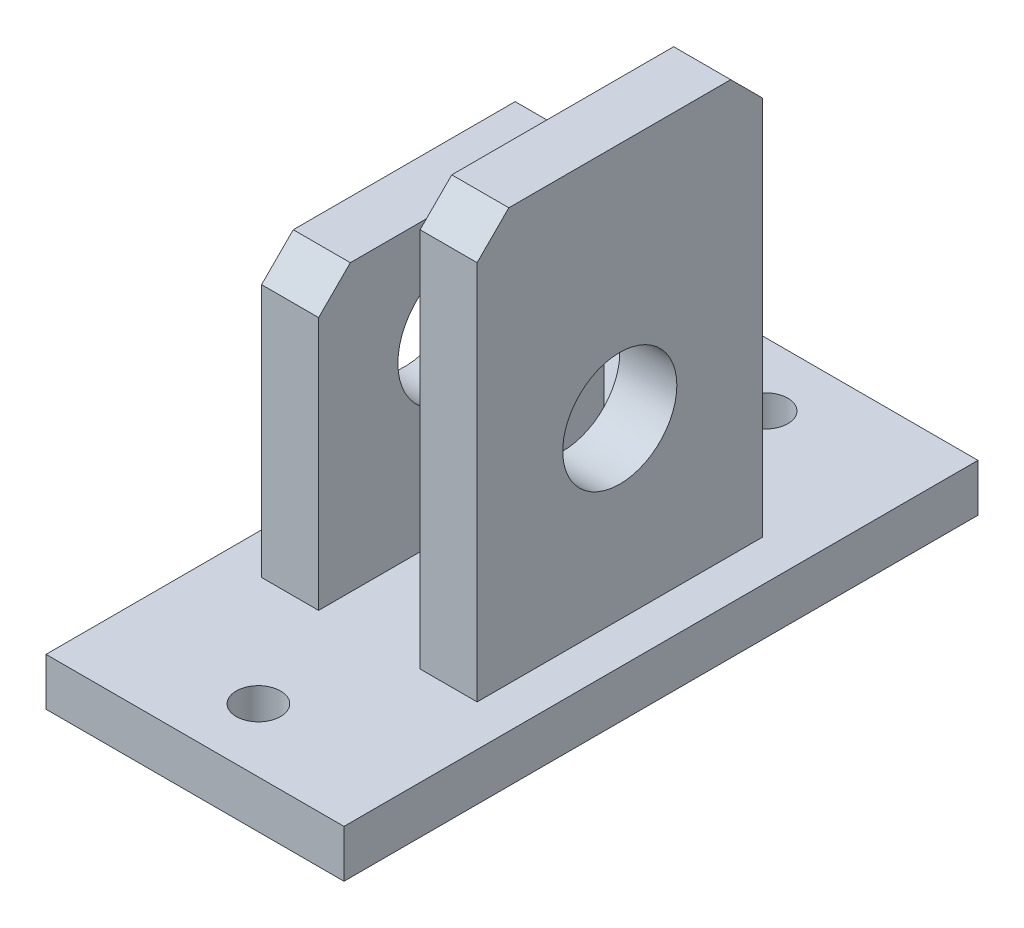
ISO-10303-21;
HEADER;
FILE_DESCRIPTION(('STEP AP214'),'2;1');
FILE_NAME('part.step','',(''),(''),'','','');
FILE_SCHEMA(('AUTOMOTIVE_DESIGN { 1 0 10303 214 1 1 1 1 }'));
ENDSEC;
DATA;
#1=APPLICATION_CONTEXT('core data for automotive mechanical design processes');
#2=APPLICATION_PROTOCOL_DEFINITION('international standard','automotive_design',2000,#1);
#3=PRODUCT_CONTEXT('',#1,'mechanical');
#4=PRODUCT('Part','Part','',(#3));
#5=PRODUCT_RELATED_PRODUCT_CATEGORY('part','',(#4));
#6=PRODUCT_DEFINITION_FORMATION('','',#4);
#7=PRODUCT_DEFINITION_CONTEXT('part definition',#1,'design');
#8=PRODUCT_DEFINITION('design','',#6,#7);
#9=PRODUCT_DEFINITION_SHAPE('','',#8);
#10=(LENGTH_UNIT() NAMED_UNIT(*) SI_UNIT(.MILLI.,.METRE.));
#11=(NAMED_UNIT(*) PLANE_ANGLE_UNIT() SI_UNIT($,.RADIAN.));
#12=(NAMED_UNIT(*) SI_UNIT($,.STERADIAN.) SOLID_ANGLE_UNIT());
#13=UNCERTAINTY_MEASURE_WITH_UNIT(LENGTH_MEASURE(1.E-05),#10,'distance_accuracy_value','');
#14=(GEOMETRIC_REPRESENTATION_CONTEXT(3) GLOBAL_UNCERTAINTY_ASSIGNED_CONTEXT((#13)) GLOBAL_UNIT_ASSIGNED_CONTEXT((#10,
#11,#12)) REPRESENTATION_CONTEXT('',''));
#15=CARTESIAN_POINT('',(0.,0.,0.));
#16=DIRECTION('',(0.,0.,1.));
#17=DIRECTION('',(1.,0.,0.));
#18=AXIS2_PLACEMENT_3D('',#15,#16,#17);
#19=CARTESIAN_POINT('',(0.,15.,-200.));
#20=DIRECTION('',(0.,-1.,0.));
#21=DIRECTION('',(0.,0.,-1.));
#22=AXIS2_PLACEMENT_3D('',#19,#20,#21);
#23=PLANE('',#22);
#24=CARTESIAN_POINT('',(47.,15.,-20.));
#25=DIRECTION('',(0.,1.,0.));
#26=DIRECTION('',(0.,0.,-1.));
#27=AXIS2_PLACEMENT_3D('',#24,#25,#26);
#28=CIRCLE('',#27,7.);
#29=CARTESIAN_POINT('',(47.,15.,-13.));
#30=VERTEX_POINT('',#29);
#31=EDGE_CURVE('E249',#30,#30,#28,.T.);
#32=ORIENTED_EDGE('',*,*,#31,.F.);
#33=EDGE_LOOP('',(#32));
#34=FACE_BOUND('',#33,.T.);
#35=CARTESIAN_POINT('',(47.,15.,-180.));
#36=DIRECTION('',(0.,1.,0.));
#37=DIRECTION('',(0.,0.,1.));
#38=AXIS2_PLACEMENT_3D('',#35,#36,#37);
#39=CIRCLE('',#38,7.);
#40=CARTESIAN_POINT('',(47.,15.,-173.));
#41=VERTEX_POINT('',#40);
#42=EDGE_CURVE('E245',#41,#41,#39,.T.);
#43=ORIENTED_EDGE('',*,*,#42,.F.);
#44=EDGE_LOOP('',(#43));
#45=FACE_BOUND('',#44,.T.);
#46=DIRECTION('',(1.,0.,0.));
#47=VECTOR('',#46,1.);
#48=CARTESIAN_POINT('',(63.,15.,-55.));
#49=LINE('',#48,#47);
#50=CARTESIAN_POINT('',(63.,15.,-55.));
#51=VERTEX_POINT('',#50);
#52=CARTESIAN_POINT('',(81.,15.,-55.));
#53=VERTEX_POINT('',#52);
#54=EDGE_CURVE('E192',#51,#53,#49,.T.);
#55=ORIENTED_EDGE('',*,*,#54,.F.);
#56=DIRECTION('',(0.,0.,1.));
#57=VECTOR('',#56,1.);
#58=CARTESIAN_POINT('',(63.,15.,-55.));
#59=LINE('',#58,#57);
#60=CARTESIAN_POINT('',(63.,15.,-145.));
#61=VERTEX_POINT('',#60);
#62=EDGE_CURVE('E201',#61,#51,#59,.T.);
#63=ORIENTED_EDGE('',*,*,#62,.F.);
#64=DIRECTION('',(-1.,0.,0.));
#65=VECTOR('',#64,1.);
#66=CARTESIAN_POINT('',(63.,15.,-145.));
#67=LINE('',#66,#65);
#68=CARTESIAN_POINT('',(81.,15.,-145.));
#69=VERTEX_POINT('',#68);
#70=EDGE_CURVE('E198',#69,#61,#67,.T.);
#71=ORIENTED_EDGE('',*,*,#70,.F.);
#72=DIRECTION('',(0.,0.,-1.));
#73=VECTOR('',#72,1.);
#74=CARTESIAN_POINT('',(81.,15.,-55.));
#75=LINE('',#74,#73);
#76=EDGE_CURVE('E195',#53,#69,#75,.T.);
#77=ORIENTED_EDGE('',*,*,#76,.F.);
#78=EDGE_LOOP('',(#55,#63,#71,#77));
#79=FACE_BOUND('',#78,.T.);
#80=DIRECTION('',(0.,0.,1.));
#81=VECTOR('',#80,1.);
#82=CARTESIAN_POINT('',(0.,15.,0.));
#83=LINE('',#82,#81);
#84=CARTESIAN_POINT('',(0.,15.,-200.));
#85=VERTEX_POINT('',#84);
#86=CARTESIAN_POINT('',(0.,15.,0.));
#87=VERTEX_POINT('',#86);
#88=EDGE_CURVE('E213',#85,#87,#83,.T.);
#89=ORIENTED_EDGE('',*,*,#88,.T.);
#90=DIRECTION('',(1.,0.,0.));
#91=VECTOR('',#90,1.);
#92=CARTESIAN_POINT('',(0.,15.,0.));
#93=LINE('',#92,#91);
#94=CARTESIAN_POINT('',(94.,15.,0.));
#95=VERTEX_POINT('',#94);
#96=EDGE_CURVE('E216',#87,#95,#93,.T.);
#97=ORIENTED_EDGE('',*,*,#96,.T.);
#98=DIRECTION('',(0.,0.,-1.));
#99=VECTOR('',#98,1.);
#100=CARTESIAN_POINT('',(94.,15.,0.));
#101=LINE('',#100,#99);
#102=CARTESIAN_POINT('',(94.,15.,-200.));
#103=VERTEX_POINT('',#102);
#104=EDGE_CURVE('E219',#95,#103,#101,.T.);
#105=ORIENTED_EDGE('',*,*,#104,.T.);
#106=DIRECTION('',(-1.,0.,0.));
#107=VECTOR('',#106,1.);
#108=CARTESIAN_POINT('',(0.,15.,-200.));
#109=LINE('',#108,#107);
#110=EDGE_CURVE('E221',#103,#85,#109,.T.);
#111=ORIENTED_EDGE('',*,*,#110,.T.);
#112=EDGE_LOOP('',(#89,#97,#105,#111));
#113=FACE_BOUND('',#112,.T.);
#114=DIRECTION('',(0.,0.,1.));
#115=VECTOR('',#114,1.);
#116=CARTESIAN_POINT('',(13.,15.,-55.));
#117=LINE('',#116,#115);
#118=CARTESIAN_POINT('',(13.,15.,-145.));
#119=VERTEX_POINT('',#118);
#120=CARTESIAN_POINT('',(13.,15.,-55.));
#121=VERTEX_POINT('',#120);
#122=EDGE_CURVE('E159',#119,#121,#117,.T.);
#123=ORIENTED_EDGE('',*,*,#122,.F.);
#124=DIRECTION('',(-1.,0.,0.));
#125=VECTOR('',#124,1.);
#126=CARTESIAN_POINT('',(31.,15.,-145.));
#127=LINE('',#126,#125);
#128=CARTESIAN_POINT('',(31.,15.,-145.));
#129=VERTEX_POINT('',#128);
#130=EDGE_CURVE('E171',#129,#119,#127,.T.);
#131=ORIENTED_EDGE('',*,*,#130,.F.);
#132=DIRECTION('',(0.,0.,-1.));
#133=VECTOR('',#132,1.);
#134=CARTESIAN_POINT('',(31.,15.,-55.));
#135=LINE('',#134,#133);
#136=CARTESIAN_POINT('',(31.,15.,-55.));
#137=VERTEX_POINT('',#136);
#138=EDGE_CURVE('E180',#137,#129,#135,.T.);
#139=ORIENTED_EDGE('',*,*,#138,.F.);
#140=DIRECTION('',(1.,0.,0.));
#141=VECTOR('',#140,1.);
#142=CARTESIAN_POINT('',(31.,15.,-55.));
#143=LINE('',#142,#141);
#144=EDGE_CURVE('E174',#121,#137,#143,.T.);
#145=ORIENTED_EDGE('',*,*,#144,.F.);
#146=EDGE_LOOP('',(#123,#131,#139,#145));
#147=FACE_BOUND('',#146,.T.);
#148=ADVANCED_FACE('F41',(#34,#45,#79,#113,#147),#23,.F.);
#149=CARTESIAN_POINT('',(0.,15.,0.));
#150=DIRECTION('',(1.,0.,0.));
#151=DIRECTION('',(0.,0.,-1.));
#152=AXIS2_PLACEMENT_3D('',#149,#150,#151);
#153=PLANE('',#152);
#154=DIRECTION('',(0.,0.,1.));
#155=VECTOR('',#154,1.);
#156=CARTESIAN_POINT('',(0.,0.,0.));
#157=LINE('',#156,#155);
#158=CARTESIAN_POINT('',(0.,0.,-200.));
#159=VERTEX_POINT('',#158);
#160=CARTESIAN_POINT('',(0.,0.,0.));
#161=VERTEX_POINT('',#160);
#162=EDGE_CURVE('E212',#159,#161,#157,.T.);
#163=ORIENTED_EDGE('',*,*,#162,.T.);
#164=DIRECTION('',(0.,-1.,0.));
#165=VECTOR('',#164,1.);
#166=CARTESIAN_POINT('',(0.,15.,0.));
#167=LINE('',#166,#165);
#168=EDGE_CURVE('E239',#87,#161,#167,.T.);
#169=ORIENTED_EDGE('',*,*,#168,.F.);
#170=ORIENTED_EDGE('',*,*,#88,.F.);
#171=DIRECTION('',(0.,-1.,0.));
#172=VECTOR('',#171,1.);
#173=CARTESIAN_POINT('',(0.,15.,-200.));
#174=LINE('',#173,#172);
#175=EDGE_CURVE('E223',#85,#159,#174,.T.);
#176=ORIENTED_EDGE('',*,*,#175,.T.);
#177=EDGE_LOOP('',(#163,#169,#170,#176));
#178=FACE_BOUND('',#177,.T.);
#179=ADVANCED_FACE('F348',(#178),#153,.F.);
#180=CARTESIAN_POINT('',(0.,15.,0.));
#181=DIRECTION('',(0.,0.,-1.));
#182=DIRECTION('',(-1.,0.,0.));
#183=AXIS2_PLACEMENT_3D('',#180,#181,#182);
#184=PLANE('',#183);
#185=DIRECTION('',(1.,0.,0.));
#186=VECTOR('',#185,1.);
#187=CARTESIAN_POINT('',(0.,0.,0.));
#188=LINE('',#187,#186);
#189=CARTESIAN_POINT('',(94.,0.,0.));
#190=VERTEX_POINT('',#189);
#191=EDGE_CURVE('E226',#161,#190,#188,.T.);
#192=ORIENTED_EDGE('',*,*,#191,.T.);
#193=DIRECTION('',(0.,-1.,0.));
#194=VECTOR('',#193,1.);
#195=CARTESIAN_POINT('',(94.,15.,0.));
#196=LINE('',#195,#194);
#197=EDGE_CURVE('E236',#95,#190,#196,.T.);
#198=ORIENTED_EDGE('',*,*,#197,.F.);
#199=ORIENTED_EDGE('',*,*,#96,.F.);
#200=ORIENTED_EDGE('',*,*,#168,.T.);
#201=EDGE_LOOP('',(#192,#198,#199,#200));
#202=FACE_BOUND('',#201,.T.);
#203=ADVANCED_FACE('F356',(#202),#184,.F.);
#204=CARTESIAN_POINT('',(94.,15.,0.));
#205=DIRECTION('',(-1.,0.,0.));
#206=DIRECTION('',(0.,0.,1.));
#207=AXIS2_PLACEMENT_3D('',#204,#205,#206);
#208=PLANE('',#207);
#209=DIRECTION('',(0.,0.,-1.));
#210=VECTOR('',#209,1.);
#211=CARTESIAN_POINT('',(94.,0.,0.));
#212=LINE('',#211,#210);
#213=CARTESIAN_POINT('',(94.,0.,-200.));
#214=VERTEX_POINT('',#213);
#215=EDGE_CURVE('E228',#190,#214,#212,.T.);
#216=ORIENTED_EDGE('',*,*,#215,.T.);
#217=DIRECTION('',(0.,-1.,0.));
#218=VECTOR('',#217,1.);
#219=CARTESIAN_POINT('',(94.,15.,-200.));
#220=LINE('',#219,#218);
#221=EDGE_CURVE('E233',#103,#214,#220,.T.);
#222=ORIENTED_EDGE('',*,*,#221,.F.);
#223=ORIENTED_EDGE('',*,*,#104,.F.);
#224=ORIENTED_EDGE('',*,*,#197,.T.);
#225=EDGE_LOOP('',(#216,#222,#223,#224));
#226=FACE_BOUND('',#225,.T.);
#227=ADVANCED_FACE('F368',(#226),#208,.F.);
#228=CARTESIAN_POINT('',(0.,15.,-200.));
#229=DIRECTION('',(0.,0.,1.));
#230=DIRECTION('',(1.,0.,0.));
#231=AXIS2_PLACEMENT_3D('',#228,#229,#230);
#232=PLANE('',#231);
#233=DIRECTION('',(-1.,0.,0.));
#234=VECTOR('',#233,1.);
#235=CARTESIAN_POINT('',(0.,0.,-200.));
#236=LINE('',#235,#234);
#237=EDGE_CURVE('E217',#214,#159,#236,.T.);
#238=ORIENTED_EDGE('',*,*,#237,.T.);
#239=ORIENTED_EDGE('',*,*,#175,.F.);
#240=ORIENTED_EDGE('',*,*,#110,.F.);
#241=ORIENTED_EDGE('',*,*,#221,.T.);
#242=EDGE_LOOP('',(#238,#239,#240,#241));
#243=FACE_BOUND('',#242,.T.);
#244=ADVANCED_FACE('F365',(#243),#232,.F.);
#245=CARTESIAN_POINT('',(0.,0.,-200.));
#246=DIRECTION('',(0.,-1.,0.));
#247=DIRECTION('',(0.,0.,-1.));
#248=AXIS2_PLACEMENT_3D('',#245,#246,#247);
#249=PLANE('',#248);
#250=CARTESIAN_POINT('',(47.,0.,-20.));
#251=DIRECTION('',(0.,-1.,0.));
#252=DIRECTION('',(0.,0.,-1.));
#253=AXIS2_PLACEMENT_3D('',#250,#251,#252);
#254=CIRCLE('',#253,7.);
#255=CARTESIAN_POINT('',(47.,0.,-13.));
#256=VERTEX_POINT('',#255);
#257=EDGE_CURVE('E246',#256,#256,#254,.T.);
#258=ORIENTED_EDGE('',*,*,#257,.F.);
#259=EDGE_LOOP('',(#258));
#260=FACE_BOUND('',#259,.T.);
#261=CARTESIAN_POINT('',(47.,0.,-180.));
#262=DIRECTION('',(0.,-1.,0.));
#263=DIRECTION('',(0.,0.,-1.));
#264=AXIS2_PLACEMENT_3D('',#261,#262,#263);
#265=CIRCLE('',#264,7.);
#266=CARTESIAN_POINT('',(47.,0.,-173.));
#267=VERTEX_POINT('',#266);
#268=EDGE_CURVE('E175',#267,#267,#265,.T.);
#269=ORIENTED_EDGE('',*,*,#268,.F.);
#270=EDGE_LOOP('',(#269));
#271=FACE_BOUND('',#270,.T.);
#272=ORIENTED_EDGE('',*,*,#162,.F.);
#273=ORIENTED_EDGE('',*,*,#237,.F.);
#274=ORIENTED_EDGE('',*,*,#215,.F.);
#275=ORIENTED_EDGE('',*,*,#191,.F.);
#276=EDGE_LOOP('',(#272,#273,#274,#275));
#277=FACE_BOUND('',#276,.T.);
#278=ADVANCED_FACE('F363',(#260,#271,#277),#249,.T.);
#279=CARTESIAN_POINT('',(63.,105.,-55.));
#280=DIRECTION('',(0.,0.,-1.));
#281=DIRECTION('',(-1.,0.,0.));
#282=AXIS2_PLACEMENT_3D('',#279,#280,#281);
#283=PLANE('',#282);
#284=DIRECTION('',(0.,-1.,0.));
#285=VECTOR('',#284,1.);
#286=CARTESIAN_POINT('',(81.,105.,-55.));
#287=LINE('',#286,#285);
#288=CARTESIAN_POINT('',(81.,135.,-55.));
#289=VERTEX_POINT('',#288);
#290=EDGE_CURVE('E210',#289,#53,#287,.T.);
#291=ORIENTED_EDGE('',*,*,#290,.F.);
#292=DIRECTION('',(-1.,0.,0.));
#293=VECTOR('',#292,1.);
#294=CARTESIAN_POINT('',(63.,135.,-55.));
#295=LINE('',#294,#293);
#296=CARTESIAN_POINT('',(63.,135.,-55.));
#297=VERTEX_POINT('',#296);
#298=EDGE_CURVE('E49',#289,#297,#295,.T.);
#299=ORIENTED_EDGE('',*,*,#298,.T.);
#300=DIRECTION('',(0.,-1.,0.));
#301=VECTOR('',#300,1.);
#302=CARTESIAN_POINT('',(63.,105.,-55.));
#303=LINE('',#302,#301);
#304=EDGE_CURVE('E204',#297,#51,#303,.T.);
#305=ORIENTED_EDGE('',*,*,#304,.T.);
#306=ORIENTED_EDGE('',*,*,#54,.T.);
#307=EDGE_LOOP('',(#291,#299,#305,#306));
#308=FACE_BOUND('',#307,.T.);
#309=ADVANCED_FACE('F285',(#308),#283,.F.);
#310=CARTESIAN_POINT('',(81.,105.,-55.));
#311=DIRECTION('',(-1.,0.,0.));
#312=DIRECTION('',(0.,0.,1.));
#313=AXIS2_PLACEMENT_3D('',#310,#311,#312);
#314=PLANE('',#313);
#315=CARTESIAN_POINT('',(81.,70.,-100.));
#316=DIRECTION('',(1.,0.,0.));
#317=DIRECTION('',(0.,0.,-1.));
#318=AXIS2_PLACEMENT_3D('',#315,#316,#317);
#319=CIRCLE('',#318,18.);
#320=CARTESIAN_POINT('',(81.,70.,-118.));
#321=VERTEX_POINT('',#320);
#322=EDGE_CURVE('E253',#321,#321,#319,.T.);
#323=ORIENTED_EDGE('',*,*,#322,.F.);
#324=EDGE_LOOP('',(#323));
#325=FACE_BOUND('',#324,.T.);
#326=DIRECTION('',(0.,-1.,0.));
#327=VECTOR('',#326,1.);
#328=CARTESIAN_POINT('',(81.,105.,-145.));
#329=LINE('',#328,#327);
#330=CARTESIAN_POINT('',(81.,135.,-145.));
#331=VERTEX_POINT('',#330);
#332=EDGE_CURVE('E208',#331,#69,#329,.T.);
#333=ORIENTED_EDGE('',*,*,#332,.F.);
#334=DIRECTION('',(0.,0.707106781186549,0.707106781186545));
#335=VECTOR('',#334,1.);
#336=CARTESIAN_POINT('',(81.,145.,-135.));
#337=LINE('',#336,#335);
#338=CARTESIAN_POINT('',(81.,145.,-135.));
#339=VERTEX_POINT('',#338);
#340=EDGE_CURVE('E281',#331,#339,#337,.T.);
#341=ORIENTED_EDGE('',*,*,#340,.T.);
#342=DIRECTION('',(0.,0.,-1.));
#343=VECTOR('',#342,1.);
#344=CARTESIAN_POINT('',(81.,145.,-145.));
#345=LINE('',#344,#343);
#346=CARTESIAN_POINT('',(81.,145.,-65.));
#347=VERTEX_POINT('',#346);
#348=EDGE_CURVE('E299',#347,#339,#345,.T.);
#349=ORIENTED_EDGE('',*,*,#348,.F.);
#350=DIRECTION('',(0.,-0.707106781186548,0.707106781186546));
#351=VECTOR('',#350,1.);
#352=CARTESIAN_POINT('',(81.,145.,-65.));
#353=LINE('',#352,#351);
#354=EDGE_CURVE('E56',#347,#289,#353,.T.);
#355=ORIENTED_EDGE('',*,*,#354,.T.);
#356=ORIENTED_EDGE('',*,*,#290,.T.);
#357=ORIENTED_EDGE('',*,*,#76,.T.);
#358=EDGE_LOOP('',(#333,#341,#349,#355,#356,#357));
#359=FACE_BOUND('',#358,.T.);
#360=ADVANCED_FACE('F302',(#325,#359),#314,.F.);
#361=CARTESIAN_POINT('',(63.,105.,-145.));
#362=DIRECTION('',(0.,0.,1.));
#363=DIRECTION('',(1.,0.,0.));
#364=AXIS2_PLACEMENT_3D('',#361,#362,#363);
#365=PLANE('',#364);
#366=DIRECTION('',(0.,-1.,0.));
#367=VECTOR('',#366,1.);
#368=CARTESIAN_POINT('',(63.,105.,-145.));
#369=LINE('',#368,#367);
#370=CARTESIAN_POINT('',(63.,135.,-145.));
#371=VERTEX_POINT('',#370);
#372=EDGE_CURVE('E206',#371,#61,#369,.T.);
#373=ORIENTED_EDGE('',*,*,#372,.F.);
#374=DIRECTION('',(1.,0.,0.));
#375=VECTOR('',#374,1.);
#376=CARTESIAN_POINT('',(81.,135.,-145.));
#377=LINE('',#376,#375);
#378=EDGE_CURVE('E64',#371,#331,#377,.T.);
#379=ORIENTED_EDGE('',*,*,#378,.T.);
#380=ORIENTED_EDGE('',*,*,#332,.T.);
#381=ORIENTED_EDGE('',*,*,#70,.T.);
#382=EDGE_LOOP('',(#373,#379,#380,#381));
#383=FACE_BOUND('',#382,.T.);
#384=ADVANCED_FACE('F433',(#383),#365,.F.);
#385=CARTESIAN_POINT('',(63.,105.,-55.));
#386=DIRECTION('',(1.,0.,0.));
#387=DIRECTION('',(0.,0.,-1.));
#388=AXIS2_PLACEMENT_3D('',#385,#386,#387);
#389=PLANE('',#388);
#390=CARTESIAN_POINT('',(63.,70.,-100.));
#391=DIRECTION('',(1.,0.,0.));
#392=DIRECTION('',(0.,0.,-1.));
#393=AXIS2_PLACEMENT_3D('',#390,#391,#392);
#394=CIRCLE('',#393,18.);
#395=CARTESIAN_POINT('',(63.,70.,-118.));
#396=VERTEX_POINT('',#395);
#397=EDGE_CURVE('E311',#396,#396,#394,.T.);
#398=ORIENTED_EDGE('',*,*,#397,.T.);
#399=EDGE_LOOP('',(#398));
#400=FACE_BOUND('',#399,.T.);
#401=DIRECTION('',(0.,0.,1.));
#402=VECTOR('',#401,1.);
#403=CARTESIAN_POINT('',(63.,145.,-145.));
#404=LINE('',#403,#402);
#405=CARTESIAN_POINT('',(63.,145.,-135.));
#406=VERTEX_POINT('',#405);
#407=CARTESIAN_POINT('',(63.,145.,-65.));
#408=VERTEX_POINT('',#407);
#409=EDGE_CURVE('E301',#406,#408,#404,.T.);
#410=ORIENTED_EDGE('',*,*,#409,.F.);
#411=DIRECTION('',(0.,-0.707106781186549,-0.707106781186545));
#412=VECTOR('',#411,1.);
#413=CARTESIAN_POINT('',(63.,145.,-135.));
#414=LINE('',#413,#412);
#415=EDGE_CURVE('E277',#406,#371,#414,.T.);
#416=ORIENTED_EDGE('',*,*,#415,.T.);
#417=ORIENTED_EDGE('',*,*,#372,.T.);
#418=ORIENTED_EDGE('',*,*,#62,.T.);
#419=ORIENTED_EDGE('',*,*,#304,.F.);
#420=DIRECTION('',(0.,0.707106781186548,-0.707106781186546));
#421=VECTOR('',#420,1.);
#422=CARTESIAN_POINT('',(63.,145.,-65.));
#423=LINE('',#422,#421);
#424=EDGE_CURVE('E275',#297,#408,#423,.T.);
#425=ORIENTED_EDGE('',*,*,#424,.T.);
#426=EDGE_LOOP('',(#410,#416,#417,#418,#419,#425));
#427=FACE_BOUND('',#426,.T.);
#428=ADVANCED_FACE('F291',(#400,#427),#389,.F.);
#429=CARTESIAN_POINT('',(13.,105.,-55.));
#430=DIRECTION('',(1.,0.,0.));
#431=DIRECTION('',(0.,0.,-1.));
#432=AXIS2_PLACEMENT_3D('',#429,#430,#431);
#433=PLANE('',#432);
#434=CARTESIAN_POINT('',(13.0000000000001,70.,-100.));
#435=DIRECTION('',(-1.,0.,0.));
#436=DIRECTION('',(0.,0.,1.));
#437=AXIS2_PLACEMENT_3D('',#434,#435,#436);
#438=CIRCLE('',#437,20.);
#439=CARTESIAN_POINT('',(13.0000000000001,70.,-80.));
#440=VERTEX_POINT('',#439);
#441=EDGE_CURVE('E254',#440,#440,#438,.T.);
#442=ORIENTED_EDGE('',*,*,#441,.F.);
#443=EDGE_LOOP('',(#442));
#444=FACE_BOUND('',#443,.T.);
#445=DIRECTION('',(0.,0.,1.));
#446=VECTOR('',#445,1.);
#447=CARTESIAN_POINT('',(13.,105.,-55.));
#448=LINE('',#447,#446);
#449=CARTESIAN_POINT('',(13.,105.,-135.));
#450=VERTEX_POINT('',#449);
#451=CARTESIAN_POINT('',(13.,105.,-65.));
#452=VERTEX_POINT('',#451);
#453=EDGE_CURVE('E179',#450,#452,#448,.T.);
#454=ORIENTED_EDGE('',*,*,#453,.F.);
#455=DIRECTION('',(0.,-0.707106781186549,-0.707106781186545));
#456=VECTOR('',#455,1.);
#457=CARTESIAN_POINT('',(13.,105.,-135.));
#458=LINE('',#457,#456);
#459=CARTESIAN_POINT('',(13.,95.,-145.));
#460=VERTEX_POINT('',#459);
#461=EDGE_CURVE('E160',#450,#460,#458,.T.);
#462=ORIENTED_EDGE('',*,*,#461,.T.);
#463=DIRECTION('',(0.,-1.,0.));
#464=VECTOR('',#463,1.);
#465=CARTESIAN_POINT('',(13.,105.,-145.));
#466=LINE('',#465,#464);
#467=EDGE_CURVE('E154',#460,#119,#466,.T.);
#468=ORIENTED_EDGE('',*,*,#467,.T.);
#469=ORIENTED_EDGE('',*,*,#122,.T.);
#470=DIRECTION('',(0.,-1.,0.));
#471=VECTOR('',#470,1.);
#472=CARTESIAN_POINT('',(13.,105.,-55.));
#473=LINE('',#472,#471);
#474=CARTESIAN_POINT('',(13.,95.,-55.));
#475=VERTEX_POINT('',#474);
#476=EDGE_CURVE('E190',#475,#121,#473,.T.);
#477=ORIENTED_EDGE('',*,*,#476,.F.);
#478=DIRECTION('',(0.,0.70710678118655,-0.707106781186545));
#479=VECTOR('',#478,1.);
#480=CARTESIAN_POINT('',(13.,105.,-65.));
#481=LINE('',#480,#479);
#482=EDGE_CURVE('E260',#475,#452,#481,.T.);
#483=ORIENTED_EDGE('',*,*,#482,.T.);
#484=EDGE_LOOP('',(#454,#462,#468,#469,#477,#483));
#485=FACE_BOUND('',#484,.T.);
#486=ADVANCED_FACE('F157',(#444,#485),#433,.F.);
#487=CARTESIAN_POINT('',(31.,105.,-55.));
#488=DIRECTION('',(0.,0.,-1.));
#489=DIRECTION('',(-1.,0.,0.));
#490=AXIS2_PLACEMENT_3D('',#487,#488,#489);
#491=PLANE('',#490);
#492=DIRECTION('',(0.,-1.,0.));
#493=VECTOR('',#492,1.);
#494=CARTESIAN_POINT('',(31.,105.,-55.));
#495=LINE('',#494,#493);
#496=CARTESIAN_POINT('',(31.,95.,-55.));
#497=VERTEX_POINT('',#496);
#498=EDGE_CURVE('E188',#497,#137,#495,.T.);
#499=ORIENTED_EDGE('',*,*,#498,.F.);
#500=DIRECTION('',(-1.,0.,0.));
#501=VECTOR('',#500,1.);
#502=CARTESIAN_POINT('',(13.,95.,-55.));
#503=LINE('',#502,#501);
#504=EDGE_CURVE('E11',#497,#475,#503,.T.);
#505=ORIENTED_EDGE('',*,*,#504,.T.);
#506=ORIENTED_EDGE('',*,*,#476,.T.);
#507=ORIENTED_EDGE('',*,*,#144,.T.);
#508=EDGE_LOOP('',(#499,#505,#506,#507));
#509=FACE_BOUND('',#508,.T.);
#510=ADVANCED_FACE('F321',(#509),#491,.F.);
#511=CARTESIAN_POINT('',(31.,105.,-55.));
#512=DIRECTION('',(-1.,0.,0.));
#513=DIRECTION('',(0.,0.,1.));
#514=AXIS2_PLACEMENT_3D('',#511,#512,#513);
#515=PLANE('',#514);
#516=CARTESIAN_POINT('',(31.,70.,-100.));
#517=DIRECTION('',(-1.,0.,0.));
#518=DIRECTION('',(0.,0.,1.));
#519=AXIS2_PLACEMENT_3D('',#516,#517,#518);
#520=CIRCLE('',#519,20.);
#521=CARTESIAN_POINT('',(31.,70.,-80.));
#522=VERTEX_POINT('',#521);
#523=EDGE_CURVE('E250',#522,#522,#520,.T.);
#524=ORIENTED_EDGE('',*,*,#523,.T.);
#525=EDGE_LOOP('',(#524));
#526=FACE_BOUND('',#525,.T.);
#527=DIRECTION('',(0.,-1.,0.));
#528=VECTOR('',#527,1.);
#529=CARTESIAN_POINT('',(31.,105.,-145.));
#530=LINE('',#529,#528);
#531=CARTESIAN_POINT('',(31.,95.,-145.));
#532=VERTEX_POINT('',#531);
#533=EDGE_CURVE('E164',#532,#129,#530,.T.);
#534=ORIENTED_EDGE('',*,*,#533,.F.);
#535=DIRECTION('',(0.,0.707106781186549,0.707106781186545));
#536=VECTOR('',#535,1.);
#537=CARTESIAN_POINT('',(31.,105.,-135.));
#538=LINE('',#537,#536);
#539=CARTESIAN_POINT('',(31.,105.,-135.));
#540=VERTEX_POINT('',#539);
#541=EDGE_CURVE('E267',#532,#540,#538,.T.);
#542=ORIENTED_EDGE('',*,*,#541,.T.);
#543=DIRECTION('',(0.,0.,-1.));
#544=VECTOR('',#543,1.);
#545=CARTESIAN_POINT('',(31.,105.,-55.));
#546=LINE('',#545,#544);
#547=CARTESIAN_POINT('',(31.,105.,-65.));
#548=VERTEX_POINT('',#547);
#549=EDGE_CURVE('E165',#548,#540,#546,.T.);
#550=ORIENTED_EDGE('',*,*,#549,.F.);
#551=DIRECTION('',(0.,-0.70710678118655,0.707106781186545));
#552=VECTOR('',#551,1.);
#553=CARTESIAN_POINT('',(31.,105.,-65.));
#554=LINE('',#553,#552);
#555=EDGE_CURVE('E265',#548,#497,#554,.T.);
#556=ORIENTED_EDGE('',*,*,#555,.T.);
#557=ORIENTED_EDGE('',*,*,#498,.T.);
#558=ORIENTED_EDGE('',*,*,#138,.T.);
#559=EDGE_LOOP('',(#534,#542,#550,#556,#557,#558));
#560=FACE_BOUND('',#559,.T.);
#561=ADVANCED_FACE('F331',(#526,#560),#515,.F.);
#562=CARTESIAN_POINT('',(31.,105.,-145.));
#563=DIRECTION('',(0.,0.,1.));
#564=DIRECTION('',(1.,0.,0.));
#565=AXIS2_PLACEMENT_3D('',#562,#563,#564);
#566=PLANE('',#565);
#567=ORIENTED_EDGE('',*,*,#467,.F.);
#568=DIRECTION('',(1.,0.,0.));
#569=VECTOR('',#568,1.);
#570=CARTESIAN_POINT('',(31.,95.,-145.));
#571=LINE('',#570,#569);
#572=EDGE_CURVE('E263',#460,#532,#571,.T.);
#573=ORIENTED_EDGE('',*,*,#572,.T.);
#574=ORIENTED_EDGE('',*,*,#533,.T.);
#575=ORIENTED_EDGE('',*,*,#130,.T.);
#576=EDGE_LOOP('',(#567,#573,#574,#575));
#577=FACE_BOUND('',#576,.T.);
#578=ADVANCED_FACE('F177',(#577),#566,.F.);
#579=CARTESIAN_POINT('',(13.,105.,-145.));
#580=DIRECTION('',(0.,1.,0.));
#581=DIRECTION('',(0.,0.,1.));
#582=AXIS2_PLACEMENT_3D('',#579,#580,#581);
#583=PLANE('',#582);
#584=ORIENTED_EDGE('',*,*,#549,.T.);
#585=DIRECTION('',(-1.,0.,0.));
#586=VECTOR('',#585,1.);
#587=CARTESIAN_POINT('',(13.,105.,-135.));
#588=LINE('',#587,#586);
#589=EDGE_CURVE('E257',#540,#450,#588,.T.);
#590=ORIENTED_EDGE('',*,*,#589,.T.);
#591=ORIENTED_EDGE('',*,*,#453,.T.);
#592=DIRECTION('',(1.,0.,0.));
#593=VECTOR('',#592,1.);
#594=CARTESIAN_POINT('',(31.,105.,-65.));
#595=LINE('',#594,#593);
#596=EDGE_CURVE('E242',#452,#548,#595,.T.);
#597=ORIENTED_EDGE('',*,*,#596,.T.);
#598=EDGE_LOOP('',(#584,#590,#591,#597));
#599=FACE_BOUND('',#598,.T.);
#600=ADVANCED_FACE('F328',(#599),#583,.T.);
#601=CARTESIAN_POINT('',(47.,-75.,-180.));
#602=DIRECTION('',(0.,1.,0.));
#603=DIRECTION('',(0.,0.,1.));
#604=AXIS2_PLACEMENT_3D('',#601,#602,#603);
#605=CYLINDRICAL_SURFACE('',#604,7.);
#606=CARTESIAN_POINT('',(47.,0.,-173.));
#607=CARTESIAN_POINT('',(47.,0.156250000000001,-173.));
#608=CARTESIAN_POINT('',(47.,0.312500000000003,-173.));
#609=CARTESIAN_POINT('',(47.,0.625000000000001,-173.));
#610=CARTESIAN_POINT('',(47.,0.781249999999997,-173.));
#611=CARTESIAN_POINT('',(47.,1.09375,-173.));
#612=CARTESIAN_POINT('',(47.,1.25,-173.));
#613=CARTESIAN_POINT('',(47.,1.5625,-173.));
#614=CARTESIAN_POINT('',(47.,1.71875,-173.));
#615=CARTESIAN_POINT('',(47.,2.03125,-173.));
#616=CARTESIAN_POINT('',(47.,2.1875,-173.));
#617=CARTESIAN_POINT('',(47.,2.49999999999999,-173.));
#618=CARTESIAN_POINT('',(47.,2.65624999999999,-173.));
#619=CARTESIAN_POINT('',(47.,2.96875,-173.));
#620=CARTESIAN_POINT('',(47.,3.125,-173.));
#621=CARTESIAN_POINT('',(47.,3.4375,-173.));
#622=CARTESIAN_POINT('',(47.,3.59375,-173.));
#623=CARTESIAN_POINT('',(47.,3.90625,-173.));
#624=CARTESIAN_POINT('',(47.,4.0625,-173.));
#625=CARTESIAN_POINT('',(47.,4.37499999999999,-173.));
#626=CARTESIAN_POINT('',(47.,4.53125,-173.));
#627=CARTESIAN_POINT('',(47.,4.84375,-173.));
#628=CARTESIAN_POINT('',(47.,5.,-173.));
#629=CARTESIAN_POINT('',(47.,5.3125,-173.));
#630=CARTESIAN_POINT('',(47.,5.46874999999999,-173.));
#631=CARTESIAN_POINT('',(47.,5.78124999999999,-173.));
#632=CARTESIAN_POINT('',(47.,5.93749999999999,-173.));
#633=CARTESIAN_POINT('',(47.,6.25,-173.));
#634=CARTESIAN_POINT('',(47.,6.40625,-173.));
#635=CARTESIAN_POINT('',(47.,6.71875,-173.));
#636=CARTESIAN_POINT('',(47.,6.87499999999999,-173.));
#637=CARTESIAN_POINT('',(47.,7.18749999999999,-173.));
#638=CARTESIAN_POINT('',(47.,7.34374999999999,-173.));
#639=CARTESIAN_POINT('',(47.,7.65624999999999,-173.));
#640=CARTESIAN_POINT('',(47.,7.8125,-173.));
#641=CARTESIAN_POINT('',(47.,8.12499999999999,-173.));
#642=CARTESIAN_POINT('',(47.,8.28124999999999,-173.));
#643=CARTESIAN_POINT('',(47.,8.59374999999999,-173.));
#644=CARTESIAN_POINT('',(47.,8.74999999999999,-173.));
#645=CARTESIAN_POINT('',(47.,9.06249999999999,-173.));
#646=CARTESIAN_POINT('',(47.,9.21874999999999,-173.));
#647=CARTESIAN_POINT('',(47.,9.53124999999999,-173.));
#648=CARTESIAN_POINT('',(47.,9.68749999999999,-173.));
#649=CARTESIAN_POINT('',(47.,9.99999999999999,-173.));
#650=CARTESIAN_POINT('',(47.,10.15625,-173.));
#651=CARTESIAN_POINT('',(47.,10.46875,-173.));
#652=CARTESIAN_POINT('',(47.,10.625,-173.));
#653=CARTESIAN_POINT('',(47.,10.9375,-173.));
#654=CARTESIAN_POINT('',(47.,11.09375,-173.));
#655=CARTESIAN_POINT('',(47.,11.40625,-173.));
#656=CARTESIAN_POINT('',(47.,11.5625,-173.));
#657=CARTESIAN_POINT('',(47.,11.875,-173.));
#658=CARTESIAN_POINT('',(47.,12.03125,-173.));
#659=CARTESIAN_POINT('',(47.,12.34375,-173.));
#660=CARTESIAN_POINT('',(47.,12.5,-173.));
#661=CARTESIAN_POINT('',(47.,12.8125,-173.));
#662=CARTESIAN_POINT('',(47.,12.96875,-173.));
#663=CARTESIAN_POINT('',(47.,13.28125,-173.));
#664=CARTESIAN_POINT('',(47.,13.4375,-173.));
#665=CARTESIAN_POINT('',(47.,13.75,-173.));
#666=CARTESIAN_POINT('',(47.,13.90625,-173.));
#667=CARTESIAN_POINT('',(47.,14.21875,-173.));
#668=CARTESIAN_POINT('',(47.,14.375,-173.));
#669=CARTESIAN_POINT('',(47.,14.6875,-173.));
#670=CARTESIAN_POINT('',(47.,14.84375,-173.));
#671=CARTESIAN_POINT('',(47.,15.,-173.));
#672=B_SPLINE_CURVE_WITH_KNOTS('',3,(#606,#607,#608,#609,#610,#611,#612,#613,#614,#615,#616,
#617,#618,#619,#620,#621,#622,#623,#624,#625,#626,#627,#628,#629,#630,#631,#632,#633,#634,#635,
#636,#637,#638,#639,#640,#641,#642,#643,#644,#645,#646,#647,#648,#649,#650,#651,#652,#653,#654,
#655,#656,#657,#658,#659,#660,#661,#662,#663,#664,#665,#666,#667,#668,#669,#670,#671),
.UNSPECIFIED.,.F.,.F.,(4,2,2,2,2,2,2,2,2,2,2,2,2,2,2,2,2,2,2,2,2,2,2,2,2,2,2,2,2,2,2,2,4),(0.,
0.468750000000004,0.937499999999994,1.40625,1.875,2.34374999999999,2.8125,3.28125,3.75,
4.21874999999999,4.6875,5.15625,5.62499999999999,6.09374999999999,6.5625,7.03124999999999,
7.49999999999999,7.96875,8.43749999999999,8.90624999999999,9.37499999999999,9.84374999999998,
10.3125,10.78125,11.25,11.71875,12.1875,12.65625,13.125,13.59375,14.0625,14.53125,15.),.UNSPECIFIED.);
#673=EDGE_CURVE('BSEAM499',#267,#41,#672,.T.);
#674=ORIENTED_EDGE('',*,*,#268,.T.);
#675=ORIENTED_EDGE('',*,*,#42,.T.);
#676=ORIENTED_EDGE('',*,*,#673,.T.);
#677=ORIENTED_EDGE('',*,*,#673,.F.);
#678=EDGE_LOOP('',(#674,#676,#675,#677));
#679=FACE_BOUND('',#678,.T.);
#680=ADVANCED_FACE('F499',(#679),#605,.F.);
#681=CARTESIAN_POINT('',(47.,-75.,-20.));
#682=DIRECTION('',(0.,1.,0.));
#683=DIRECTION('',(0.,0.,1.));
#684=AXIS2_PLACEMENT_3D('',#681,#682,#683);
#685=CYLINDRICAL_SURFACE('',#684,7.);
#686=CARTESIAN_POINT('',(47.,0.,-13.));
#687=CARTESIAN_POINT('',(47.,0.156250000000001,-13.));
#688=CARTESIAN_POINT('',(47.,0.312500000000003,-13.));
#689=CARTESIAN_POINT('',(47.,0.625000000000001,-13.));
#690=CARTESIAN_POINT('',(47.,0.781249999999997,-13.));
#691=CARTESIAN_POINT('',(47.,1.09375,-13.));
#692=CARTESIAN_POINT('',(47.,1.25,-13.));
#693=CARTESIAN_POINT('',(47.,1.5625,-13.));
#694=CARTESIAN_POINT('',(47.,1.71875,-13.));
#695=CARTESIAN_POINT('',(47.,2.03125,-13.));
#696=CARTESIAN_POINT('',(47.,2.1875,-13.));
#697=CARTESIAN_POINT('',(47.,2.49999999999999,-13.));
#698=CARTESIAN_POINT('',(47.,2.65624999999999,-13.));
#699=CARTESIAN_POINT('',(47.,2.96875,-13.));
#700=CARTESIAN_POINT('',(47.,3.125,-13.));
#701=CARTESIAN_POINT('',(47.,3.4375,-13.));
#702=CARTESIAN_POINT('',(47.,3.59375,-13.));
#703=CARTESIAN_POINT('',(47.,3.90625,-13.));
#704=CARTESIAN_POINT('',(47.,4.0625,-13.));
#705=CARTESIAN_POINT('',(47.,4.37499999999999,-13.));
#706=CARTESIAN_POINT('',(47.,4.53125,-13.));
#707=CARTESIAN_POINT('',(47.,4.84375,-13.));
#708=CARTESIAN_POINT('',(47.,5.,-13.));
#709=CARTESIAN_POINT('',(47.,5.3125,-13.));
#710=CARTESIAN_POINT('',(47.,5.46874999999999,-13.));
#711=CARTESIAN_POINT('',(47.,5.78124999999999,-13.));
#712=CARTESIAN_POINT('',(47.,5.93749999999999,-13.));
#713=CARTESIAN_POINT('',(47.,6.25,-13.));
#714=CARTESIAN_POINT('',(47.,6.40625,-13.));
#715=CARTESIAN_POINT('',(47.,6.71875,-13.));
#716=CARTESIAN_POINT('',(47.,6.87499999999999,-13.));
#717=CARTESIAN_POINT('',(47.,7.18749999999999,-13.));
#718=CARTESIAN_POINT('',(47.,7.34374999999999,-13.));
#719=CARTESIAN_POINT('',(47.,7.65624999999999,-13.));
#720=CARTESIAN_POINT('',(47.,7.8125,-13.));
#721=CARTESIAN_POINT('',(47.,8.12499999999999,-13.));
#722=CARTESIAN_POINT('',(47.,8.28124999999999,-13.));
#723=CARTESIAN_POINT('',(47.,8.59374999999999,-13.));
#724=CARTESIAN_POINT('',(47.,8.74999999999999,-13.));
#725=CARTESIAN_POINT('',(47.,9.06249999999999,-13.));
#726=CARTESIAN_POINT('',(47.,9.21874999999999,-13.));
#727=CARTESIAN_POINT('',(47.,9.53124999999999,-13.));
#728=CARTESIAN_POINT('',(47.,9.68749999999999,-13.));
#729=CARTESIAN_POINT('',(47.,9.99999999999999,-13.));
#730=CARTESIAN_POINT('',(47.,10.15625,-13.));
#731=CARTESIAN_POINT('',(47.,10.46875,-13.));
#732=CARTESIAN_POINT('',(47.,10.625,-13.));
#733=CARTESIAN_POINT('',(47.,10.9375,-13.));
#734=CARTESIAN_POINT('',(47.,11.09375,-13.));
#735=CARTESIAN_POINT('',(47.,11.40625,-13.));
#736=CARTESIAN_POINT('',(47.,11.5625,-13.));
#737=CARTESIAN_POINT('',(47.,11.875,-13.));
#738=CARTESIAN_POINT('',(47.,12.03125,-13.));
#739=CARTESIAN_POINT('',(47.,12.34375,-13.));
#740=CARTESIAN_POINT('',(47.,12.5,-13.));
#741=CARTESIAN_POINT('',(47.,12.8125,-13.));
#742=CARTESIAN_POINT('',(47.,12.96875,-13.));
#743=CARTESIAN_POINT('',(47.,13.28125,-13.));
#744=CARTESIAN_POINT('',(47.,13.4375,-13.));
#745=CARTESIAN_POINT('',(47.,13.75,-13.));
#746=CARTESIAN_POINT('',(47.,13.90625,-13.));
#747=CARTESIAN_POINT('',(47.,14.21875,-13.));
#748=CARTESIAN_POINT('',(47.,14.375,-13.));
#749=CARTESIAN_POINT('',(47.,14.6875,-13.));
#750=CARTESIAN_POINT('',(47.,14.84375,-13.));
#751=CARTESIAN_POINT('',(47.,15.,-13.));
#752=B_SPLINE_CURVE_WITH_KNOTS('',3,(#686,#687,#688,#689,#690,#691,#692,#693,#694,#695,#696,
#697,#698,#699,#700,#701,#702,#703,#704,#705,#706,#707,#708,#709,#710,#711,#712,#713,#714,#715,
#716,#717,#718,#719,#720,#721,#722,#723,#724,#725,#726,#727,#728,#729,#730,#731,#732,#733,#734,
#735,#736,#737,#738,#739,#740,#741,#742,#743,#744,#745,#746,#747,#748,#749,#750,#751),
.UNSPECIFIED.,.F.,.F.,(4,2,2,2,2,2,2,2,2,2,2,2,2,2,2,2,2,2,2,2,2,2,2,2,2,2,2,2,2,2,2,2,4),(0.,
0.468750000000004,0.937499999999994,1.40625,1.875,2.34374999999999,2.8125,3.28125,3.75,
4.21874999999999,4.6875,5.15625,5.62499999999999,6.09374999999999,6.5625,7.03124999999999,
7.49999999999999,7.96875,8.43749999999999,8.90624999999999,9.37499999999999,9.84374999999998,
10.3125,10.78125,11.25,11.71875,12.1875,12.65625,13.125,13.59375,14.0625,14.53125,15.),.UNSPECIFIED.);
#753=EDGE_CURVE('BSEAM507',#256,#30,#752,.T.);
#754=ORIENTED_EDGE('',*,*,#257,.T.);
#755=ORIENTED_EDGE('',*,*,#31,.T.);
#756=ORIENTED_EDGE('',*,*,#753,.T.);
#757=ORIENTED_EDGE('',*,*,#753,.F.);
#758=EDGE_LOOP('',(#754,#756,#755,#757));
#759=FACE_BOUND('',#758,.T.);
#760=ADVANCED_FACE('F507',(#759),#685,.F.);
#761=CARTESIAN_POINT('',(0.,70.,-100.));
#762=DIRECTION('',(1.,0.,0.));
#763=DIRECTION('',(0.,0.,-1.));
#764=AXIS2_PLACEMENT_3D('',#761,#762,#763);
#765=CYLINDRICAL_SURFACE('',#764,18.);
#766=ORIENTED_EDGE('',*,*,#322,.T.);
#767=EDGE_LOOP('',(#766));
#768=FACE_BOUND('',#767,.T.);
#769=ORIENTED_EDGE('',*,*,#397,.F.);
#770=EDGE_LOOP('',(#769));
#771=FACE_BOUND('',#770,.T.);
#772=ADVANCED_FACE('F517',(#768,#771),#765,.F.);
#773=CARTESIAN_POINT('',(33.0000000000001,70.,-100.));
#774=DIRECTION('',(-1.,0.,0.));
#775=DIRECTION('',(0.,0.,1.));
#776=AXIS2_PLACEMENT_3D('',#773,#774,#775);
#777=CYLINDRICAL_SURFACE('',#776,20.);
#778=ORIENTED_EDGE('',*,*,#441,.T.);
#779=EDGE_LOOP('',(#778));
#780=FACE_BOUND('',#779,.T.);
#781=ORIENTED_EDGE('',*,*,#523,.F.);
#782=EDGE_LOOP('',(#781));
#783=FACE_BOUND('',#782,.T.);
#784=ADVANCED_FACE('F344',(#780,#783),#777,.F.);
#785=CARTESIAN_POINT('',(63.,145.,-55.));
#786=DIRECTION('',(0.,1.,0.));
#787=DIRECTION('',(0.,0.,1.));
#788=AXIS2_PLACEMENT_3D('',#785,#786,#787);
#789=PLANE('',#788);
#790=ORIENTED_EDGE('',*,*,#348,.T.);
#791=DIRECTION('',(-1.,0.,0.));
#792=VECTOR('',#791,1.);
#793=CARTESIAN_POINT('',(63.,145.,-135.));
#794=LINE('',#793,#792);
#795=EDGE_CURVE('E272',#339,#406,#794,.T.);
#796=ORIENTED_EDGE('',*,*,#795,.T.);
#797=ORIENTED_EDGE('',*,*,#409,.T.);
#798=DIRECTION('',(1.,0.,0.));
#799=VECTOR('',#798,1.);
#800=CARTESIAN_POINT('',(81.,145.,-65.));
#801=LINE('',#800,#799);
#802=EDGE_CURVE('E269',#408,#347,#801,.T.);
#803=ORIENTED_EDGE('',*,*,#802,.T.);
#804=EDGE_LOOP('',(#790,#796,#797,#803));
#805=FACE_BOUND('',#804,.T.);
#806=ADVANCED_FACE('F298',(#805),#789,.T.);
#807=CARTESIAN_POINT('',(13.,105.,-135.));
#808=DIRECTION('',(0.,0.707106781186545,-0.707106781186549));
#809=DIRECTION('',(0.,0.70710678118655,0.707106781186546));
#810=AXIS2_PLACEMENT_3D('',#807,#808,#809);
#811=PLANE('',#810);
#812=ORIENTED_EDGE('',*,*,#541,.F.);
#813=ORIENTED_EDGE('',*,*,#572,.F.);
#814=ORIENTED_EDGE('',*,*,#461,.F.);
#815=ORIENTED_EDGE('',*,*,#589,.F.);
#816=EDGE_LOOP('',(#812,#813,#814,#815));
#817=FACE_BOUND('',#816,.T.);
#818=ADVANCED_FACE('F334',(#817),#811,.T.);
#819=CARTESIAN_POINT('',(63.,145.,-135.));
#820=DIRECTION('',(0.,0.707106781186545,-0.707106781186549));
#821=DIRECTION('',(0.,0.70710678118655,0.707106781186546));
#822=AXIS2_PLACEMENT_3D('',#819,#820,#821);
#823=PLANE('',#822);
#824=ORIENTED_EDGE('',*,*,#340,.F.);
#825=ORIENTED_EDGE('',*,*,#378,.F.);
#826=ORIENTED_EDGE('',*,*,#415,.F.);
#827=ORIENTED_EDGE('',*,*,#795,.F.);
#828=EDGE_LOOP('',(#824,#825,#826,#827));
#829=FACE_BOUND('',#828,.T.);
#830=ADVANCED_FACE('F336',(#829),#823,.T.);
#831=CARTESIAN_POINT('',(63.,145.,-65.));
#832=DIRECTION('',(0.,0.707106781186546,0.707106781186548));
#833=DIRECTION('',(0.,-0.707106781186549,0.707106781186547));
#834=AXIS2_PLACEMENT_3D('',#831,#832,#833);
#835=PLANE('',#834);
#836=ORIENTED_EDGE('',*,*,#424,.F.);
#837=ORIENTED_EDGE('',*,*,#298,.F.);
#838=ORIENTED_EDGE('',*,*,#354,.F.);
#839=ORIENTED_EDGE('',*,*,#802,.F.);
#840=EDGE_LOOP('',(#836,#837,#838,#839));
#841=FACE_BOUND('',#840,.T.);
#842=ADVANCED_FACE('F295',(#841),#835,.T.);
#843=CARTESIAN_POINT('',(13.,105.,-65.));
#844=DIRECTION('',(0.,0.707106781186545,0.70710678118655));
#845=DIRECTION('',(0.,-0.70710678118655,0.707106781186545));
#846=AXIS2_PLACEMENT_3D('',#843,#844,#845);
#847=PLANE('',#846);
#848=ORIENTED_EDGE('',*,*,#482,.F.);
#849=ORIENTED_EDGE('',*,*,#504,.F.);
#850=ORIENTED_EDGE('',*,*,#555,.F.);
#851=ORIENTED_EDGE('',*,*,#596,.F.);
#852=EDGE_LOOP('',(#848,#849,#850,#851));
#853=FACE_BOUND('',#852,.T.);
#854=ADVANCED_FACE('F43',(#853),#847,.T.);
#855=CLOSED_SHELL('',(#148,#179,#203,#227,#244,#278,#309,#360,#384,#428,#486,#510,#561,#578,
#600,#680,#760,#772,#784,#806,#818,#830,#842,#854));
#856=MANIFOLD_SOLID_BREP('B2',#855);
#857=ADVANCED_BREP_SHAPE_REPRESENTATION('',(#18,#856),#14);
#858=SHAPE_DEFINITION_REPRESENTATION(#9,#857);
ENDSEC;
END-ISO-10303-21;
